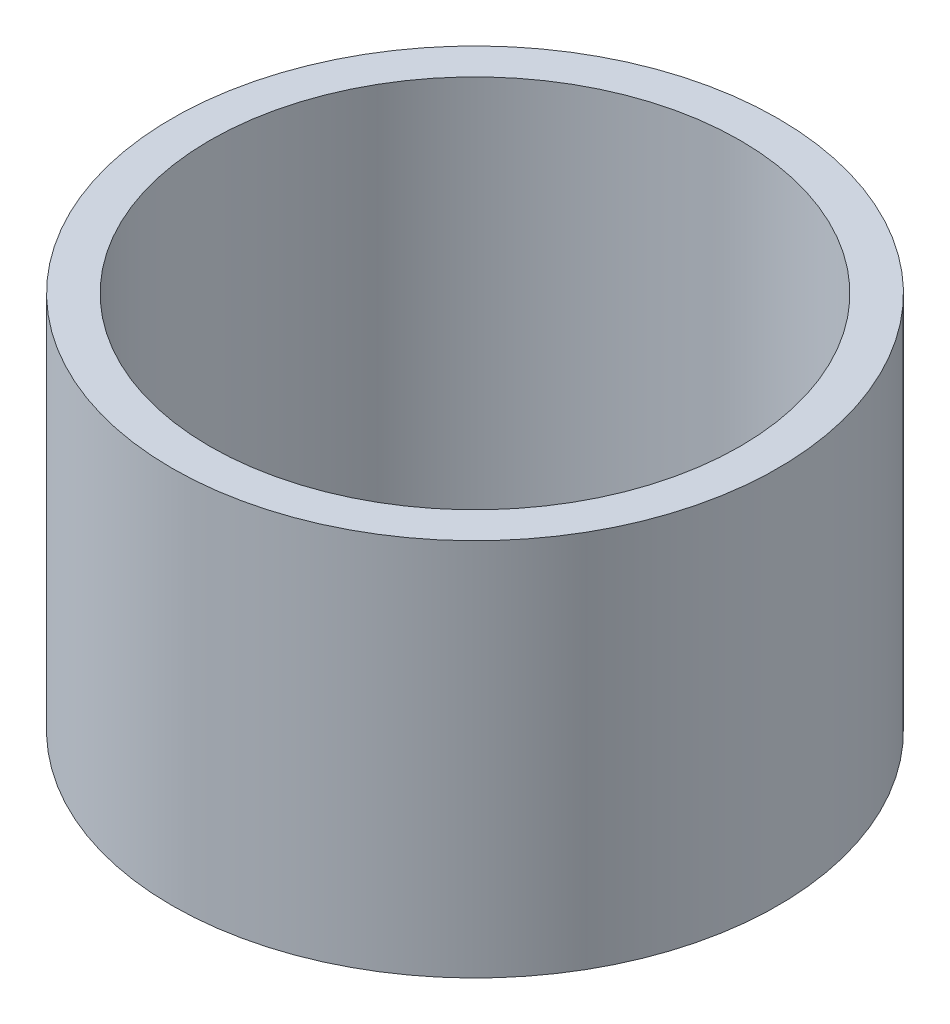
ISO-10303-21;
HEADER;
FILE_DESCRIPTION(('STEP AP214'),'2;1');
FILE_NAME('part.step','',(''),(''),'','','');
FILE_SCHEMA(('AUTOMOTIVE_DESIGN { 1 0 10303 214 1 1 1 1 }'));
ENDSEC;
DATA;
#1=APPLICATION_CONTEXT('core data for automotive mechanical design processes');
#2=APPLICATION_PROTOCOL_DEFINITION('international standard','automotive_design',2000,#1);
#3=PRODUCT_CONTEXT('',#1,'mechanical');
#4=PRODUCT('Part','Part','',(#3));
#5=PRODUCT_RELATED_PRODUCT_CATEGORY('part','',(#4));
#6=PRODUCT_DEFINITION_FORMATION('','',#4);
#7=PRODUCT_DEFINITION_CONTEXT('part definition',#1,'design');
#8=PRODUCT_DEFINITION('design','',#6,#7);
#9=PRODUCT_DEFINITION_SHAPE('','',#8);
#10=(LENGTH_UNIT() NAMED_UNIT(*) SI_UNIT(.MILLI.,.METRE.));
#11=(NAMED_UNIT(*) PLANE_ANGLE_UNIT() SI_UNIT($,.RADIAN.));
#12=(NAMED_UNIT(*) SI_UNIT($,.STERADIAN.) SOLID_ANGLE_UNIT());
#13=UNCERTAINTY_MEASURE_WITH_UNIT(LENGTH_MEASURE(1.E-05),#10,'distance_accuracy_value','');
#14=(GEOMETRIC_REPRESENTATION_CONTEXT(3) GLOBAL_UNCERTAINTY_ASSIGNED_CONTEXT((#13)) GLOBAL_UNIT_ASSIGNED_CONTEXT((#10,
#11,#12)) REPRESENTATION_CONTEXT('',''));
#15=CARTESIAN_POINT('',(0.,0.,0.));
#16=DIRECTION('',(0.,0.,1.));
#17=DIRECTION('',(1.,0.,0.));
#18=AXIS2_PLACEMENT_3D('',#15,#16,#17);
#19=CARTESIAN_POINT('',(0.,10.,0.));
#20=DIRECTION('',(0.,1.,0.));
#21=DIRECTION('',(0.,0.,1.));
#22=AXIS2_PLACEMENT_3D('',#19,#20,#21);
#23=PLANE('',#22);
#24=CARTESIAN_POINT('',(0.,10.,0.));
#25=DIRECTION('',(0.,1.,0.));
#26=DIRECTION('',(0.,0.,1.));
#27=AXIS2_PLACEMENT_3D('',#24,#25,#26);
#28=CIRCLE('',#27,8.);
#29=CARTESIAN_POINT('',(0.,10.,8.));
#30=VERTEX_POINT('',#29);
#31=EDGE_CURVE('E10',#30,#30,#28,.T.);
#32=ORIENTED_EDGE('',*,*,#31,.T.);
#33=EDGE_LOOP('',(#32));
#34=FACE_BOUND('',#33,.T.);
#35=CARTESIAN_POINT('',(0.,10.,0.));
#36=DIRECTION('',(0.,1.,0.));
#37=DIRECTION('',(0.,0.,1.));
#38=AXIS2_PLACEMENT_3D('',#35,#36,#37);
#39=CIRCLE('',#38,7.);
#40=CARTESIAN_POINT('',(0.,10.,7.));
#41=VERTEX_POINT('',#40);
#42=EDGE_CURVE('E50',#41,#41,#39,.T.);
#43=ORIENTED_EDGE('',*,*,#42,.F.);
#44=EDGE_LOOP('',(#43));
#45=FACE_BOUND('',#44,.T.);
#46=ADVANCED_FACE('F37',(#34,#45),#23,.T.);
#47=CARTESIAN_POINT('',(0.,0.,0.));
#48=DIRECTION('',(0.,1.,0.));
#49=DIRECTION('',(0.,0.,1.));
#50=AXIS2_PLACEMENT_3D('',#47,#48,#49);
#51=PLANE('',#50);
#52=CARTESIAN_POINT('',(0.,0.,0.));
#53=DIRECTION('',(0.,1.,0.));
#54=DIRECTION('',(0.,0.,1.));
#55=AXIS2_PLACEMENT_3D('',#52,#53,#54);
#56=CIRCLE('',#55,8.);
#57=CARTESIAN_POINT('',(0.,0.,8.));
#58=VERTEX_POINT('',#57);
#59=EDGE_CURVE('E41',#58,#58,#56,.T.);
#60=ORIENTED_EDGE('',*,*,#59,.F.);
#61=EDGE_LOOP('',(#60));
#62=FACE_BOUND('',#61,.T.);
#63=CARTESIAN_POINT('',(0.,0.,0.));
#64=DIRECTION('',(0.,1.,0.));
#65=DIRECTION('',(0.,0.,1.));
#66=AXIS2_PLACEMENT_3D('',#63,#64,#65);
#67=CIRCLE('',#66,7.);
#68=CARTESIAN_POINT('',(0.,0.,7.));
#69=VERTEX_POINT('',#68);
#70=EDGE_CURVE('E52',#69,#69,#67,.T.);
#71=ORIENTED_EDGE('',*,*,#70,.T.);
#72=EDGE_LOOP('',(#71));
#73=FACE_BOUND('',#72,.T.);
#74=ADVANCED_FACE('F64',(#62,#73),#51,.F.);
#75=CARTESIAN_POINT('',(0.,10.,0.));
#76=DIRECTION('',(0.,-1.,0.));
#77=DIRECTION('',(0.,0.,-1.));
#78=AXIS2_PLACEMENT_3D('',#75,#76,#77);
#79=CYLINDRICAL_SURFACE('',#78,8.);
#80=ORIENTED_EDGE('',*,*,#31,.F.);
#81=EDGE_LOOP('',(#80));
#82=FACE_BOUND('',#81,.T.);
#83=ORIENTED_EDGE('',*,*,#59,.T.);
#84=EDGE_LOOP('',(#83));
#85=FACE_BOUND('',#84,.T.);
#86=ADVANCED_FACE('F39',(#82,#85),#79,.T.);
#87=CARTESIAN_POINT('',(0.,10.,0.));
#88=DIRECTION('',(0.,-1.,0.));
#89=DIRECTION('',(0.,0.,-1.));
#90=AXIS2_PLACEMENT_3D('',#87,#88,#89);
#91=CYLINDRICAL_SURFACE('',#90,7.);
#92=ORIENTED_EDGE('',*,*,#42,.T.);
#93=EDGE_LOOP('',(#92));
#94=FACE_BOUND('',#93,.T.);
#95=ORIENTED_EDGE('',*,*,#70,.F.);
#96=EDGE_LOOP('',(#95));
#97=FACE_BOUND('',#96,.T.);
#98=ADVANCED_FACE('F60',(#94,#97),#91,.F.);
#99=CLOSED_SHELL('',(#46,#74,#86,#98));
#100=MANIFOLD_SOLID_BREP('B2',#99);
#101=ADVANCED_BREP_SHAPE_REPRESENTATION('',(#18,#100),#14);
#102=SHAPE_DEFINITION_REPRESENTATION(#9,#101);
ENDSEC;
END-ISO-10303-21;
